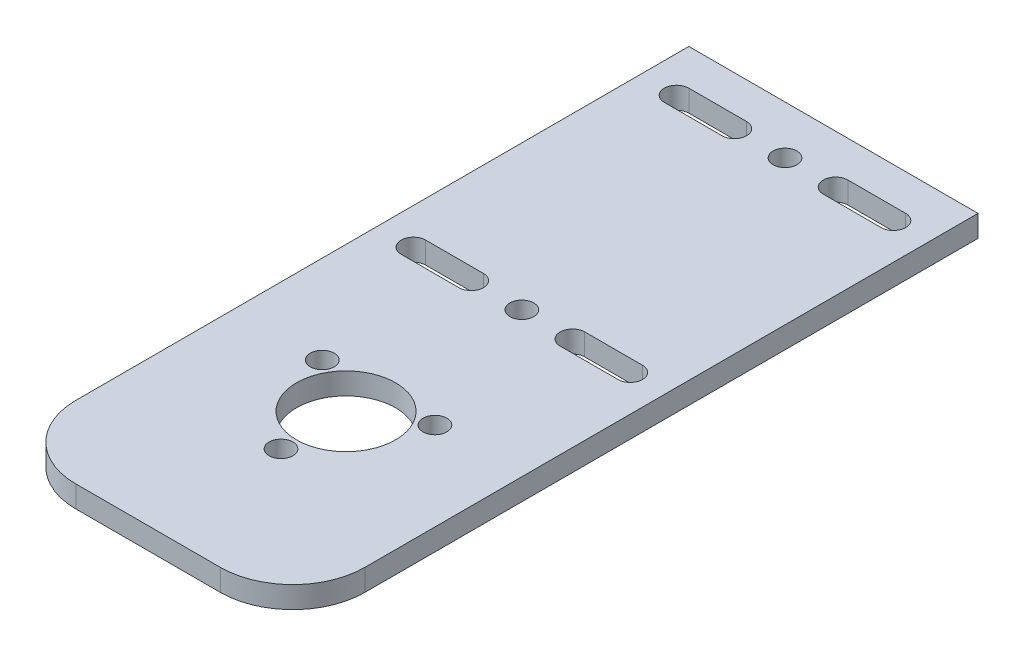
ISO-10303-21;
HEADER;
FILE_DESCRIPTION(('STEP AP214'),'2;1');
FILE_NAME('part.step','',(''),(''),'','','');
FILE_SCHEMA(('AUTOMOTIVE_DESIGN { 1 0 10303 214 1 1 1 1 }'));
ENDSEC;
DATA;
#1=APPLICATION_CONTEXT('core data for automotive mechanical design processes');
#2=APPLICATION_PROTOCOL_DEFINITION('international standard','automotive_design',2000,#1);
#3=PRODUCT_CONTEXT('',#1,'mechanical');
#4=PRODUCT('Part','Part','',(#3));
#5=PRODUCT_RELATED_PRODUCT_CATEGORY('part','',(#4));
#6=PRODUCT_DEFINITION_FORMATION('','',#4);
#7=PRODUCT_DEFINITION_CONTEXT('part definition',#1,'design');
#8=PRODUCT_DEFINITION('design','',#6,#7);
#9=PRODUCT_DEFINITION_SHAPE('','',#8);
#10=(LENGTH_UNIT() NAMED_UNIT(*) SI_UNIT(.MILLI.,.METRE.));
#11=(NAMED_UNIT(*) PLANE_ANGLE_UNIT() SI_UNIT($,.RADIAN.));
#12=(NAMED_UNIT(*) SI_UNIT($,.STERADIAN.) SOLID_ANGLE_UNIT());
#13=UNCERTAINTY_MEASURE_WITH_UNIT(LENGTH_MEASURE(1.E-05),#10,'distance_accuracy_value','');
#14=(GEOMETRIC_REPRESENTATION_CONTEXT(3) GLOBAL_UNCERTAINTY_ASSIGNED_CONTEXT((#13)) GLOBAL_UNIT_ASSIGNED_CONTEXT((#10,
#11,#12)) REPRESENTATION_CONTEXT('',''));
#15=CARTESIAN_POINT('',(0.,0.,0.));
#16=DIRECTION('',(0.,0.,1.));
#17=DIRECTION('',(1.,0.,0.));
#18=AXIS2_PLACEMENT_3D('',#15,#16,#17);
#19=CARTESIAN_POINT('',(0.,3.,36.4));
#20=DIRECTION('',(0.,0.,-1.));
#21=DIRECTION('',(-1.,0.,0.));
#22=AXIS2_PLACEMENT_3D('',#19,#20,#21);
#23=PLANE('',#22);
#24=DIRECTION('',(1.,0.,0.));
#25=VECTOR('',#24,1.);
#26=CARTESIAN_POINT('',(0.,0.,36.4));
#27=LINE('',#26,#25);
#28=CARTESIAN_POINT('',(5.,0.,36.4));
#29=VERTEX_POINT('',#28);
#30=CARTESIAN_POINT('',(13.,0.,36.4));
#31=VERTEX_POINT('',#30);
#32=EDGE_CURVE('E316',#29,#31,#27,.T.);
#33=ORIENTED_EDGE('',*,*,#32,.T.);
#34=DIRECTION('',(0.,-1.,0.));
#35=VECTOR('',#34,1.);
#36=CARTESIAN_POINT('',(13.,3.,36.4));
#37=LINE('',#36,#35);
#38=CARTESIAN_POINT('',(13.,3.,36.4));
#39=VERTEX_POINT('',#38);
#40=EDGE_CURVE('E342',#39,#31,#37,.T.);
#41=ORIENTED_EDGE('',*,*,#40,.F.);
#42=DIRECTION('',(1.,0.,0.));
#43=VECTOR('',#42,1.);
#44=CARTESIAN_POINT('',(0.,3.,36.4));
#45=LINE('',#44,#43);
#46=CARTESIAN_POINT('',(5.,3.,36.4));
#47=VERTEX_POINT('',#46);
#48=EDGE_CURVE('E246',#47,#39,#45,.T.);
#49=ORIENTED_EDGE('',*,*,#48,.F.);
#50=DIRECTION('',(0.,-1.,0.));
#51=VECTOR('',#50,1.);
#52=CARTESIAN_POINT('',(5.,3.,36.4));
#53=LINE('',#52,#51);
#54=EDGE_CURVE('E334',#47,#29,#53,.T.);
#55=ORIENTED_EDGE('',*,*,#54,.T.);
#56=EDGE_LOOP('',(#33,#41,#49,#55));
#57=FACE_BOUND('',#56,.T.);
#58=ADVANCED_FACE('F36',(#57),#23,.F.);
#59=CARTESIAN_POINT('',(13.,3.,38.1));
#60=DIRECTION('',(0.,-1.,0.));
#61=DIRECTION('',(0.,0.,-1.));
#62=AXIS2_PLACEMENT_3D('',#59,#60,#61);
#63=CYLINDRICAL_SURFACE('',#62,1.7);
#64=CARTESIAN_POINT('',(13.,0.,38.1));
#65=DIRECTION('',(0.,1.,0.));
#66=DIRECTION('',(0.,0.,1.));
#67=AXIS2_PLACEMENT_3D('',#64,#65,#66);
#68=CIRCLE('',#67,1.7);
#69=CARTESIAN_POINT('',(13.,0.,39.8));
#70=VERTEX_POINT('',#69);
#71=EDGE_CURVE('E319',#31,#70,#68,.F.);
#72=ORIENTED_EDGE('',*,*,#71,.T.);
#73=DIRECTION('',(0.,-1.,0.));
#74=VECTOR('',#73,1.);
#75=CARTESIAN_POINT('',(13.,3.,39.8));
#76=LINE('',#75,#74);
#77=CARTESIAN_POINT('',(13.,3.,39.8));
#78=VERTEX_POINT('',#77);
#79=EDGE_CURVE('E340',#78,#70,#76,.T.);
#80=ORIENTED_EDGE('',*,*,#79,.F.);
#81=CARTESIAN_POINT('',(13.,3.,38.1));
#82=DIRECTION('',(0.,1.,0.));
#83=DIRECTION('',(0.,0.,1.));
#84=AXIS2_PLACEMENT_3D('',#81,#82,#83);
#85=CIRCLE('',#84,1.7);
#86=EDGE_CURVE('E249',#39,#78,#85,.F.);
#87=ORIENTED_EDGE('',*,*,#86,.F.);
#88=ORIENTED_EDGE('',*,*,#40,.T.);
#89=EDGE_LOOP('',(#72,#80,#87,#88));
#90=FACE_BOUND('',#89,.T.);
#91=ADVANCED_FACE('F430',(#90),#63,.F.);
#92=CARTESIAN_POINT('',(1.38083988687754E-13,3.,39.8000000000001));
#93=DIRECTION('',(0.,0.,-1.));
#94=DIRECTION('',(-1.,0.,0.));
#95=AXIS2_PLACEMENT_3D('',#92,#93,#94);
#96=PLANE('',#95);
#97=DIRECTION('',(1.,0.,0.));
#98=VECTOR('',#97,1.);
#99=CARTESIAN_POINT('',(1.38083988687754E-13,0.,39.8000000000001));
#100=LINE('',#99,#98);
#101=CARTESIAN_POINT('',(5.,0.,39.8));
#102=VERTEX_POINT('',#101);
#103=EDGE_CURVE('E322',#102,#70,#100,.T.);
#104=ORIENTED_EDGE('',*,*,#103,.F.);
#105=DIRECTION('',(0.,-1.,0.));
#106=VECTOR('',#105,1.);
#107=CARTESIAN_POINT('',(5.,3.,39.8));
#108=LINE('',#107,#106);
#109=CARTESIAN_POINT('',(5.,3.,39.8));
#110=VERTEX_POINT('',#109);
#111=EDGE_CURVE('E337',#110,#102,#108,.T.);
#112=ORIENTED_EDGE('',*,*,#111,.F.);
#113=DIRECTION('',(1.,0.,0.));
#114=VECTOR('',#113,1.);
#115=CARTESIAN_POINT('',(1.38083988687754E-13,3.,39.8000000000001));
#116=LINE('',#115,#114);
#117=EDGE_CURVE('E251',#110,#78,#116,.T.);
#118=ORIENTED_EDGE('',*,*,#117,.T.);
#119=ORIENTED_EDGE('',*,*,#79,.T.);
#120=EDGE_LOOP('',(#104,#112,#118,#119));
#121=FACE_BOUND('',#120,.T.);
#122=ADVANCED_FACE('F436',(#121),#96,.T.);
#123=CARTESIAN_POINT('',(0.,3.,36.4));
#124=DIRECTION('',(0.,0.,-1.));
#125=DIRECTION('',(-1.,0.,0.));
#126=AXIS2_PLACEMENT_3D('',#123,#124,#125);
#127=PLANE('',#126);
#128=DIRECTION('',(1.,0.,0.));
#129=VECTOR('',#128,1.);
#130=CARTESIAN_POINT('',(0.,0.,36.4));
#131=LINE('',#130,#129);
#132=CARTESIAN_POINT('',(27.,0.,36.4));
#133=VERTEX_POINT('',#132);
#134=CARTESIAN_POINT('',(35.,0.,36.4));
#135=VERTEX_POINT('',#134);
#136=EDGE_CURVE('E305',#133,#135,#131,.T.);
#137=ORIENTED_EDGE('',*,*,#136,.T.);
#138=DIRECTION('',(0.,-1.,0.));
#139=VECTOR('',#138,1.);
#140=CARTESIAN_POINT('',(35.,3.,36.4));
#141=LINE('',#140,#139);
#142=CARTESIAN_POINT('',(35.,3.,36.4));
#143=VERTEX_POINT('',#142);
#144=EDGE_CURVE('E338',#143,#135,#141,.T.);
#145=ORIENTED_EDGE('',*,*,#144,.F.);
#146=DIRECTION('',(1.,0.,0.));
#147=VECTOR('',#146,1.);
#148=CARTESIAN_POINT('',(0.,3.,36.4));
#149=LINE('',#148,#147);
#150=CARTESIAN_POINT('',(27.,3.,36.4));
#151=VERTEX_POINT('',#150);
#152=EDGE_CURVE('E236',#151,#143,#149,.T.);
#153=ORIENTED_EDGE('',*,*,#152,.F.);
#154=DIRECTION('',(0.,-1.,0.));
#155=VECTOR('',#154,1.);
#156=CARTESIAN_POINT('',(27.,3.,36.4));
#157=LINE('',#156,#155);
#158=EDGE_CURVE('E346',#151,#133,#157,.T.);
#159=ORIENTED_EDGE('',*,*,#158,.T.);
#160=EDGE_LOOP('',(#137,#145,#153,#159));
#161=FACE_BOUND('',#160,.T.);
#162=ADVANCED_FACE('F455',(#161),#127,.F.);
#163=CARTESIAN_POINT('',(35.,3.,38.1));
#164=DIRECTION('',(0.,-1.,0.));
#165=DIRECTION('',(0.,0.,-1.));
#166=AXIS2_PLACEMENT_3D('',#163,#164,#165);
#167=CYLINDRICAL_SURFACE('',#166,1.70000000000001);
#168=CARTESIAN_POINT('',(35.,0.,38.1));
#169=DIRECTION('',(0.,1.,0.));
#170=DIRECTION('',(0.,0.,1.));
#171=AXIS2_PLACEMENT_3D('',#168,#169,#170);
#172=CIRCLE('',#171,1.70000000000001);
#173=CARTESIAN_POINT('',(35.,0.,39.8));
#174=VERTEX_POINT('',#173);
#175=EDGE_CURVE('E308',#135,#174,#172,.F.);
#176=ORIENTED_EDGE('',*,*,#175,.T.);
#177=DIRECTION('',(0.,-1.,0.));
#178=VECTOR('',#177,1.);
#179=CARTESIAN_POINT('',(35.,3.,39.8));
#180=LINE('',#179,#178);
#181=CARTESIAN_POINT('',(35.,3.,39.8));
#182=VERTEX_POINT('',#181);
#183=EDGE_CURVE('E352',#182,#174,#180,.T.);
#184=ORIENTED_EDGE('',*,*,#183,.F.);
#185=CARTESIAN_POINT('',(35.,3.,38.1));
#186=DIRECTION('',(0.,1.,0.));
#187=DIRECTION('',(0.,0.,1.));
#188=AXIS2_PLACEMENT_3D('',#185,#186,#187);
#189=CIRCLE('',#188,1.70000000000001);
#190=EDGE_CURVE('E239',#143,#182,#189,.F.);
#191=ORIENTED_EDGE('',*,*,#190,.F.);
#192=ORIENTED_EDGE('',*,*,#144,.T.);
#193=EDGE_LOOP('',(#176,#184,#191,#192));
#194=FACE_BOUND('',#193,.T.);
#195=ADVANCED_FACE('F451',(#194),#167,.F.);
#196=CARTESIAN_POINT('',(-1.38083988687754E-13,3.,39.7999999999999));
#197=DIRECTION('',(0.,0.,-1.));
#198=DIRECTION('',(-1.,0.,0.));
#199=AXIS2_PLACEMENT_3D('',#196,#197,#198);
#200=PLANE('',#199);
#201=DIRECTION('',(1.,0.,0.));
#202=VECTOR('',#201,1.);
#203=CARTESIAN_POINT('',(-1.38083988687754E-13,0.,39.7999999999999));
#204=LINE('',#203,#202);
#205=CARTESIAN_POINT('',(27.,0.,39.8));
#206=VERTEX_POINT('',#205);
#207=EDGE_CURVE('E311',#206,#174,#204,.T.);
#208=ORIENTED_EDGE('',*,*,#207,.F.);
#209=DIRECTION('',(0.,-1.,0.));
#210=VECTOR('',#209,1.);
#211=CARTESIAN_POINT('',(27.,3.,39.8));
#212=LINE('',#211,#210);
#213=CARTESIAN_POINT('',(27.,3.,39.8));
#214=VERTEX_POINT('',#213);
#215=EDGE_CURVE('E349',#214,#206,#212,.T.);
#216=ORIENTED_EDGE('',*,*,#215,.F.);
#217=DIRECTION('',(1.,0.,0.));
#218=VECTOR('',#217,1.);
#219=CARTESIAN_POINT('',(-1.38083988687754E-13,3.,39.7999999999999));
#220=LINE('',#219,#218);
#221=EDGE_CURVE('E241',#214,#182,#220,.T.);
#222=ORIENTED_EDGE('',*,*,#221,.T.);
#223=ORIENTED_EDGE('',*,*,#183,.T.);
#224=EDGE_LOOP('',(#208,#216,#222,#223));
#225=FACE_BOUND('',#224,.T.);
#226=ADVANCED_FACE('F447',(#225),#200,.T.);
#227=CARTESIAN_POINT('',(35.,3.,1.69999999999999));
#228=DIRECTION('',(0.,-1.,0.));
#229=DIRECTION('',(0.,0.,-1.));
#230=AXIS2_PLACEMENT_3D('',#227,#228,#229);
#231=CYLINDRICAL_SURFACE('',#230,1.70000000000001);
#232=CARTESIAN_POINT('',(35.,0.,1.69999999999999));
#233=DIRECTION('',(0.,1.,0.));
#234=DIRECTION('',(0.,0.,1.));
#235=AXIS2_PLACEMENT_3D('',#232,#233,#234);
#236=CIRCLE('',#235,1.70000000000001);
#237=CARTESIAN_POINT('',(35.,0.,3.4));
#238=VERTEX_POINT('',#237);
#239=CARTESIAN_POINT('',(35.,0.,0.));
#240=VERTEX_POINT('',#239);
#241=EDGE_CURVE('E287',#238,#240,#236,.T.);
#242=ORIENTED_EDGE('',*,*,#241,.F.);
#243=DIRECTION('',(0.,-1.,0.));
#244=VECTOR('',#243,1.);
#245=CARTESIAN_POINT('',(35.,3.,3.4));
#246=LINE('',#245,#244);
#247=CARTESIAN_POINT('',(35.,3.,3.4));
#248=VERTEX_POINT('',#247);
#249=EDGE_CURVE('E350',#248,#238,#246,.T.);
#250=ORIENTED_EDGE('',*,*,#249,.F.);
#251=CARTESIAN_POINT('',(35.,3.,1.69999999999999));
#252=DIRECTION('',(0.,1.,0.));
#253=DIRECTION('',(0.,0.,1.));
#254=AXIS2_PLACEMENT_3D('',#251,#252,#253);
#255=CIRCLE('',#254,1.70000000000001);
#256=CARTESIAN_POINT('',(35.,3.,0.));
#257=VERTEX_POINT('',#256);
#258=EDGE_CURVE('E219',#248,#257,#255,.T.);
#259=ORIENTED_EDGE('',*,*,#258,.T.);
#260=DIRECTION('',(0.,-1.,0.));
#261=VECTOR('',#260,1.);
#262=CARTESIAN_POINT('',(35.,3.,0.));
#263=LINE('',#262,#261);
#264=EDGE_CURVE('E356',#257,#240,#263,.T.);
#265=ORIENTED_EDGE('',*,*,#264,.T.);
#266=EDGE_LOOP('',(#242,#250,#259,#265));
#267=FACE_BOUND('',#266,.T.);
#268=ADVANCED_FACE('F450',(#267),#231,.F.);
#269=CARTESIAN_POINT('',(0.,3.,3.4));
#270=DIRECTION('',(0.,0.,-1.));
#271=DIRECTION('',(-1.,0.,0.));
#272=AXIS2_PLACEMENT_3D('',#269,#270,#271);
#273=PLANE('',#272);
#274=DIRECTION('',(1.,0.,0.));
#275=VECTOR('',#274,1.);
#276=CARTESIAN_POINT('',(0.,0.,3.4));
#277=LINE('',#276,#275);
#278=CARTESIAN_POINT('',(27.,0.,3.4));
#279=VERTEX_POINT('',#278);
#280=EDGE_CURVE('E290',#279,#238,#277,.T.);
#281=ORIENTED_EDGE('',*,*,#280,.F.);
#282=DIRECTION('',(0.,-1.,0.));
#283=VECTOR('',#282,1.);
#284=CARTESIAN_POINT('',(27.,3.,3.4));
#285=LINE('',#284,#283);
#286=CARTESIAN_POINT('',(27.,3.,3.4));
#287=VERTEX_POINT('',#286);
#288=EDGE_CURVE('E361',#287,#279,#285,.T.);
#289=ORIENTED_EDGE('',*,*,#288,.F.);
#290=DIRECTION('',(1.,0.,0.));
#291=VECTOR('',#290,1.);
#292=CARTESIAN_POINT('',(0.,3.,3.4));
#293=LINE('',#292,#291);
#294=EDGE_CURVE('E222',#287,#248,#293,.T.);
#295=ORIENTED_EDGE('',*,*,#294,.T.);
#296=ORIENTED_EDGE('',*,*,#249,.T.);
#297=EDGE_LOOP('',(#281,#289,#295,#296));
#298=FACE_BOUND('',#297,.T.);
#299=ADVANCED_FACE('F475',(#298),#273,.T.);
#300=CARTESIAN_POINT('',(27.,3.,1.69999999999999));
#301=DIRECTION('',(0.,-1.,0.));
#302=DIRECTION('',(0.,0.,-1.));
#303=AXIS2_PLACEMENT_3D('',#300,#301,#302);
#304=CYLINDRICAL_SURFACE('',#303,1.70000000000001);
#305=CARTESIAN_POINT('',(27.,0.,1.69999999999999));
#306=DIRECTION('',(0.,1.,0.));
#307=DIRECTION('',(0.,0.,1.));
#308=AXIS2_PLACEMENT_3D('',#305,#306,#307);
#309=CIRCLE('',#308,1.70000000000001);
#310=CARTESIAN_POINT('',(27.,0.,0.));
#311=VERTEX_POINT('',#310);
#312=EDGE_CURVE('E293',#311,#279,#309,.T.);
#313=ORIENTED_EDGE('',*,*,#312,.F.);
#314=DIRECTION('',(0.,-1.,0.));
#315=VECTOR('',#314,1.);
#316=CARTESIAN_POINT('',(27.,3.,0.));
#317=LINE('',#316,#315);
#318=CARTESIAN_POINT('',(27.,3.,0.));
#319=VERTEX_POINT('',#318);
#320=EDGE_CURVE('E358',#319,#311,#317,.T.);
#321=ORIENTED_EDGE('',*,*,#320,.F.);
#322=CARTESIAN_POINT('',(27.,3.,1.69999999999999));
#323=DIRECTION('',(0.,1.,0.));
#324=DIRECTION('',(0.,0.,1.));
#325=AXIS2_PLACEMENT_3D('',#322,#323,#324);
#326=CIRCLE('',#325,1.70000000000001);
#327=EDGE_CURVE('E225',#319,#287,#326,.T.);
#328=ORIENTED_EDGE('',*,*,#327,.T.);
#329=ORIENTED_EDGE('',*,*,#288,.T.);
#330=EDGE_LOOP('',(#313,#321,#328,#329));
#331=FACE_BOUND('',#330,.T.);
#332=ADVANCED_FACE('F471',(#331),#304,.F.);
#333=CARTESIAN_POINT('',(13.,3.,1.69999999999999));
#334=DIRECTION('',(0.,-1.,0.));
#335=DIRECTION('',(0.,0.,-1.));
#336=AXIS2_PLACEMENT_3D('',#333,#334,#335);
#337=CYLINDRICAL_SURFACE('',#336,1.70000000000001);
#338=CARTESIAN_POINT('',(13.,0.,1.69999999999999));
#339=DIRECTION('',(0.,1.,0.));
#340=DIRECTION('',(0.,0.,1.));
#341=AXIS2_PLACEMENT_3D('',#338,#339,#340);
#342=CIRCLE('',#341,1.70000000000001);
#343=CARTESIAN_POINT('',(13.,0.,3.4));
#344=VERTEX_POINT('',#343);
#345=CARTESIAN_POINT('',(13.,0.,0.));
#346=VERTEX_POINT('',#345);
#347=EDGE_CURVE('E275',#344,#346,#342,.T.);
#348=ORIENTED_EDGE('',*,*,#347,.F.);
#349=DIRECTION('',(0.,-1.,0.));
#350=VECTOR('',#349,1.);
#351=CARTESIAN_POINT('',(13.,3.,3.4));
#352=LINE('',#351,#350);
#353=CARTESIAN_POINT('',(13.,3.,3.4));
#354=VERTEX_POINT('',#353);
#355=EDGE_CURVE('E359',#354,#344,#352,.T.);
#356=ORIENTED_EDGE('',*,*,#355,.F.);
#357=CARTESIAN_POINT('',(13.,3.,1.69999999999999));
#358=DIRECTION('',(0.,1.,0.));
#359=DIRECTION('',(0.,0.,1.));
#360=AXIS2_PLACEMENT_3D('',#357,#358,#359);
#361=CIRCLE('',#360,1.70000000000001);
#362=CARTESIAN_POINT('',(13.,3.,0.));
#363=VERTEX_POINT('',#362);
#364=EDGE_CURVE('E203',#354,#363,#361,.T.);
#365=ORIENTED_EDGE('',*,*,#364,.T.);
#366=DIRECTION('',(0.,-1.,0.));
#367=VECTOR('',#366,1.);
#368=CARTESIAN_POINT('',(13.,3.,0.));
#369=LINE('',#368,#367);
#370=EDGE_CURVE('E262',#363,#346,#369,.T.);
#371=ORIENTED_EDGE('',*,*,#370,.T.);
#372=EDGE_LOOP('',(#348,#356,#365,#371));
#373=FACE_BOUND('',#372,.T.);
#374=ADVANCED_FACE('F474',(#373),#337,.F.);
#375=CARTESIAN_POINT('',(0.,3.,3.4));
#376=DIRECTION('',(0.,0.,-1.));
#377=DIRECTION('',(-1.,0.,0.));
#378=AXIS2_PLACEMENT_3D('',#375,#376,#377);
#379=PLANE('',#378);
#380=DIRECTION('',(1.,0.,0.));
#381=VECTOR('',#380,1.);
#382=CARTESIAN_POINT('',(0.,0.,3.4));
#383=LINE('',#382,#381);
#384=CARTESIAN_POINT('',(5.,0.,3.4));
#385=VERTEX_POINT('',#384);
#386=EDGE_CURVE('E278',#385,#344,#383,.T.);
#387=ORIENTED_EDGE('',*,*,#386,.F.);
#388=DIRECTION('',(0.,-1.,0.));
#389=VECTOR('',#388,1.);
#390=CARTESIAN_POINT('',(5.,3.,3.4));
#391=LINE('',#390,#389);
#392=CARTESIAN_POINT('',(5.,3.,3.4));
#393=VERTEX_POINT('',#392);
#394=EDGE_CURVE('E367',#393,#385,#391,.T.);
#395=ORIENTED_EDGE('',*,*,#394,.F.);
#396=DIRECTION('',(1.,0.,0.));
#397=VECTOR('',#396,1.);
#398=CARTESIAN_POINT('',(0.,3.,3.4));
#399=LINE('',#398,#397);
#400=EDGE_CURVE('E207',#393,#354,#399,.T.);
#401=ORIENTED_EDGE('',*,*,#400,.T.);
#402=ORIENTED_EDGE('',*,*,#355,.T.);
#403=EDGE_LOOP('',(#387,#395,#401,#402));
#404=FACE_BOUND('',#403,.T.);
#405=ADVANCED_FACE('F489',(#404),#379,.T.);
#406=CARTESIAN_POINT('',(5.,3.,1.69999999999999));
#407=DIRECTION('',(0.,-1.,0.));
#408=DIRECTION('',(0.,0.,-1.));
#409=AXIS2_PLACEMENT_3D('',#406,#407,#408);
#410=CYLINDRICAL_SURFACE('',#409,1.70000000000001);
#411=CARTESIAN_POINT('',(5.,0.,1.69999999999999));
#412=DIRECTION('',(0.,1.,0.));
#413=DIRECTION('',(0.,0.,1.));
#414=AXIS2_PLACEMENT_3D('',#411,#412,#413);
#415=CIRCLE('',#414,1.70000000000001);
#416=CARTESIAN_POINT('',(5.,0.,0.));
#417=VERTEX_POINT('',#416);
#418=EDGE_CURVE('E281',#417,#385,#415,.T.);
#419=ORIENTED_EDGE('',*,*,#418,.F.);
#420=DIRECTION('',(0.,-1.,0.));
#421=VECTOR('',#420,1.);
#422=CARTESIAN_POINT('',(5.,3.,0.));
#423=LINE('',#422,#421);
#424=CARTESIAN_POINT('',(5.,3.,0.));
#425=VERTEX_POINT('',#424);
#426=EDGE_CURVE('E365',#425,#417,#423,.T.);
#427=ORIENTED_EDGE('',*,*,#426,.F.);
#428=CARTESIAN_POINT('',(5.,3.,1.69999999999999));
#429=DIRECTION('',(0.,1.,0.));
#430=DIRECTION('',(0.,0.,1.));
#431=AXIS2_PLACEMENT_3D('',#428,#429,#430);
#432=CIRCLE('',#431,1.70000000000001);
#433=EDGE_CURVE('E214',#425,#393,#432,.T.);
#434=ORIENTED_EDGE('',*,*,#433,.T.);
#435=ORIENTED_EDGE('',*,*,#394,.T.);
#436=EDGE_LOOP('',(#419,#427,#434,#435));
#437=FACE_BOUND('',#436,.T.);
#438=ADVANCED_FACE('F486',(#437),#410,.F.);
#439=CARTESIAN_POINT('',(0.,3.,0.));
#440=DIRECTION('',(1.,0.,0.));
#441=DIRECTION('',(0.,0.,-1.));
#442=AXIS2_PLACEMENT_3D('',#439,#440,#441);
#443=PLANE('',#442);
#444=DIRECTION('',(0.,0.,1.));
#445=VECTOR('',#444,1.);
#446=CARTESIAN_POINT('',(0.,3.,0.));
#447=LINE('',#446,#445);
#448=CARTESIAN_POINT('',(0.,3.,-5.));
#449=VERTEX_POINT('',#448);
#450=CARTESIAN_POINT('',(0.,3.,79.81));
#451=VERTEX_POINT('',#450);
#452=EDGE_CURVE('E58',#449,#451,#447,.T.);
#453=ORIENTED_EDGE('',*,*,#452,.F.);
#454=DIRECTION('',(0.,1.,0.));
#455=VECTOR('',#454,1.);
#456=CARTESIAN_POINT('',(0.,-7.,-5.));
#457=LINE('',#456,#455);
#458=CARTESIAN_POINT('',(0.,0.,-5.));
#459=VERTEX_POINT('',#458);
#460=EDGE_CURVE('E185',#459,#449,#457,.T.);
#461=ORIENTED_EDGE('',*,*,#460,.F.);
#462=DIRECTION('',(0.,0.,1.));
#463=VECTOR('',#462,1.);
#464=CARTESIAN_POINT('',(0.,0.,0.));
#465=LINE('',#464,#463);
#466=CARTESIAN_POINT('',(0.,0.,79.81));
#467=VERTEX_POINT('',#466);
#468=EDGE_CURVE('E269',#459,#467,#465,.T.);
#469=ORIENTED_EDGE('',*,*,#468,.T.);
#470=DIRECTION('',(0.,-1.,0.));
#471=VECTOR('',#470,1.);
#472=CARTESIAN_POINT('',(0.,3.,79.81));
#473=LINE('',#472,#471);
#474=EDGE_CURVE('E44',#467,#451,#473,.F.);
#475=ORIENTED_EDGE('',*,*,#474,.T.);
#476=EDGE_LOOP('',(#453,#461,#469,#475));
#477=FACE_BOUND('',#476,.T.);
#478=ADVANCED_FACE('F386',(#477),#443,.F.);
#479=CARTESIAN_POINT('',(0.,3.,89.81));
#480=DIRECTION('',(0.,0.,-1.));
#481=DIRECTION('',(-1.,0.,0.));
#482=AXIS2_PLACEMENT_3D('',#479,#480,#481);
#483=PLANE('',#482);
#484=DIRECTION('',(1.,0.,0.));
#485=VECTOR('',#484,1.);
#486=CARTESIAN_POINT('',(0.,0.,89.81));
#487=LINE('',#486,#485);
#488=CARTESIAN_POINT('',(10.,0.,89.81));
#489=VERTEX_POINT('',#488);
#490=CARTESIAN_POINT('',(30.,0.,89.81));
#491=VERTEX_POINT('',#490);
#492=EDGE_CURVE('E271',#489,#491,#487,.T.);
#493=ORIENTED_EDGE('',*,*,#492,.T.);
#494=DIRECTION('',(0.,-1.,0.));
#495=VECTOR('',#494,1.);
#496=CARTESIAN_POINT('',(30.,3.,89.81));
#497=LINE('',#496,#495);
#498=CARTESIAN_POINT('',(30.,3.,89.81));
#499=VERTEX_POINT('',#498);
#500=EDGE_CURVE('E379',#491,#499,#497,.F.);
#501=ORIENTED_EDGE('',*,*,#500,.T.);
#502=DIRECTION('',(1.,0.,0.));
#503=VECTOR('',#502,1.);
#504=CARTESIAN_POINT('',(0.,3.,89.81));
#505=LINE('',#504,#503);
#506=CARTESIAN_POINT('',(10.,3.,89.81));
#507=VERTEX_POINT('',#506);
#508=EDGE_CURVE('E204',#507,#499,#505,.T.);
#509=ORIENTED_EDGE('',*,*,#508,.F.);
#510=DIRECTION('',(0.,-1.,0.));
#511=VECTOR('',#510,1.);
#512=CARTESIAN_POINT('',(10.,3.,89.81));
#513=LINE('',#512,#511);
#514=EDGE_CURVE('E376',#507,#489,#513,.T.);
#515=ORIENTED_EDGE('',*,*,#514,.T.);
#516=EDGE_LOOP('',(#493,#501,#509,#515));
#517=FACE_BOUND('',#516,.T.);
#518=ADVANCED_FACE('F392',(#517),#483,.F.);
#519=CARTESIAN_POINT('',(40.,3.,0.));
#520=DIRECTION('',(-1.,0.,0.));
#521=DIRECTION('',(0.,0.,1.));
#522=AXIS2_PLACEMENT_3D('',#519,#520,#521);
#523=PLANE('',#522);
#524=DIRECTION('',(0.,0.,-1.));
#525=VECTOR('',#524,1.);
#526=CARTESIAN_POINT('',(40.,0.,0.));
#527=LINE('',#526,#525);
#528=CARTESIAN_POINT('',(40.,0.,79.81));
#529=VERTEX_POINT('',#528);
#530=CARTESIAN_POINT('',(40.,0.,-5.00000000000002));
#531=VERTEX_POINT('',#530);
#532=EDGE_CURVE('E196',#529,#531,#527,.T.);
#533=ORIENTED_EDGE('',*,*,#532,.T.);
#534=DIRECTION('',(0.,1.,0.));
#535=VECTOR('',#534,1.);
#536=CARTESIAN_POINT('',(40.,-7.,-5.00000000000002));
#537=LINE('',#536,#535);
#538=CARTESIAN_POINT('',(40.,3.,-5.00000000000002));
#539=VERTEX_POINT('',#538);
#540=EDGE_CURVE('E51',#531,#539,#537,.T.);
#541=ORIENTED_EDGE('',*,*,#540,.T.);
#542=DIRECTION('',(0.,0.,-1.));
#543=VECTOR('',#542,1.);
#544=CARTESIAN_POINT('',(40.,3.,0.));
#545=LINE('',#544,#543);
#546=CARTESIAN_POINT('',(40.,3.,79.81));
#547=VERTEX_POINT('',#546);
#548=EDGE_CURVE('E193',#547,#539,#545,.T.);
#549=ORIENTED_EDGE('',*,*,#548,.F.);
#550=DIRECTION('',(0.,-1.,0.));
#551=VECTOR('',#550,1.);
#552=CARTESIAN_POINT('',(40.,3.,79.81));
#553=LINE('',#552,#551);
#554=EDGE_CURVE('E345',#547,#529,#553,.T.);
#555=ORIENTED_EDGE('',*,*,#554,.T.);
#556=EDGE_LOOP('',(#533,#541,#549,#555));
#557=FACE_BOUND('',#556,.T.);
#558=ADVANCED_FACE('F191',(#557),#523,.F.);
#559=CARTESIAN_POINT('',(12.20577136594,3.,57.92));
#560=DIRECTION('',(0.,-1.,0.));
#561=DIRECTION('',(0.,0.,-1.));
#562=AXIS2_PLACEMENT_3D('',#559,#560,#561);
#563=CYLINDRICAL_SURFACE('',#562,1.65);
#564=CARTESIAN_POINT('',(12.20577136594,3.,57.92));
#565=DIRECTION('',(0.,1.,0.));
#566=DIRECTION('',(0.,0.,1.));
#567=AXIS2_PLACEMENT_3D('',#564,#565,#566);
#568=CIRCLE('',#567,1.65);
#569=CARTESIAN_POINT('',(12.20577136594,3.,59.57));
#570=VERTEX_POINT('',#569);
#571=EDGE_CURVE('E256',#570,#570,#568,.F.);
#572=ORIENTED_EDGE('',*,*,#571,.F.);
#573=EDGE_LOOP('',(#572));
#574=FACE_BOUND('',#573,.T.);
#575=CARTESIAN_POINT('',(12.20577136594,0.,57.92));
#576=DIRECTION('',(0.,1.,0.));
#577=DIRECTION('',(0.,0.,1.));
#578=AXIS2_PLACEMENT_3D('',#575,#576,#577);
#579=CIRCLE('',#578,1.65);
#580=CARTESIAN_POINT('',(12.20577136594,0.,59.57));
#581=VERTEX_POINT('',#580);
#582=EDGE_CURVE('E327',#581,#581,#579,.F.);
#583=ORIENTED_EDGE('',*,*,#582,.T.);
#584=EDGE_LOOP('',(#583));
#585=FACE_BOUND('',#584,.T.);
#586=ADVANCED_FACE('F499',(#574,#585),#563,.F.);
#587=CARTESIAN_POINT('',(5.,3.,38.1));
#588=DIRECTION('',(0.,-1.,0.));
#589=DIRECTION('',(0.,0.,-1.));
#590=AXIS2_PLACEMENT_3D('',#587,#588,#589);
#591=CYLINDRICAL_SURFACE('',#590,1.70000000000001);
#592=CARTESIAN_POINT('',(5.,0.,38.1));
#593=DIRECTION('',(0.,1.,0.));
#594=DIRECTION('',(0.,0.,1.));
#595=AXIS2_PLACEMENT_3D('',#592,#593,#594);
#596=CIRCLE('',#595,1.70000000000001);
#597=EDGE_CURVE('E325',#102,#29,#596,.F.);
#598=ORIENTED_EDGE('',*,*,#597,.T.);
#599=ORIENTED_EDGE('',*,*,#54,.F.);
#600=CARTESIAN_POINT('',(5.,3.,38.1));
#601=DIRECTION('',(0.,1.,0.));
#602=DIRECTION('',(0.,0.,1.));
#603=AXIS2_PLACEMENT_3D('',#600,#601,#602);
#604=CIRCLE('',#603,1.70000000000001);
#605=EDGE_CURVE('E254',#110,#47,#604,.F.);
#606=ORIENTED_EDGE('',*,*,#605,.F.);
#607=ORIENTED_EDGE('',*,*,#111,.T.);
#608=EDGE_LOOP('',(#598,#599,#606,#607));
#609=FACE_BOUND('',#608,.T.);
#610=ADVANCED_FACE('F445',(#609),#591,.F.);
#611=CARTESIAN_POINT('',(27.,3.,38.1));
#612=DIRECTION('',(0.,-1.,0.));
#613=DIRECTION('',(0.,0.,-1.));
#614=AXIS2_PLACEMENT_3D('',#611,#612,#613);
#615=CYLINDRICAL_SURFACE('',#614,1.7);
#616=CARTESIAN_POINT('',(27.,0.,38.1));
#617=DIRECTION('',(0.,1.,0.));
#618=DIRECTION('',(0.,0.,1.));
#619=AXIS2_PLACEMENT_3D('',#616,#617,#618);
#620=CIRCLE('',#619,1.7);
#621=EDGE_CURVE('E314',#206,#133,#620,.F.);
#622=ORIENTED_EDGE('',*,*,#621,.T.);
#623=ORIENTED_EDGE('',*,*,#158,.F.);
#624=CARTESIAN_POINT('',(27.,3.,38.1));
#625=DIRECTION('',(0.,1.,0.));
#626=DIRECTION('',(0.,0.,1.));
#627=AXIS2_PLACEMENT_3D('',#624,#625,#626);
#628=CIRCLE('',#627,1.7);
#629=EDGE_CURVE('E244',#214,#151,#628,.F.);
#630=ORIENTED_EDGE('',*,*,#629,.F.);
#631=ORIENTED_EDGE('',*,*,#215,.T.);
#632=EDGE_LOOP('',(#622,#623,#630,#631));
#633=FACE_BOUND('',#632,.T.);
#634=ADVANCED_FACE('F441',(#633),#615,.F.);
#635=CARTESIAN_POINT('',(20.,3.,38.1));
#636=DIRECTION('',(0.,-1.,0.));
#637=DIRECTION('',(0.,0.,-1.));
#638=AXIS2_PLACEMENT_3D('',#635,#636,#637);
#639=CYLINDRICAL_SURFACE('',#638,1.65);
#640=CARTESIAN_POINT('',(20.,3.,38.1));
#641=DIRECTION('',(0.,1.,0.));
#642=DIRECTION('',(0.,0.,1.));
#643=AXIS2_PLACEMENT_3D('',#640,#641,#642);
#644=CIRCLE('',#643,1.65);
#645=CARTESIAN_POINT('',(20.,3.,39.75));
#646=VERTEX_POINT('',#645);
#647=EDGE_CURVE('E233',#646,#646,#644,.F.);
#648=ORIENTED_EDGE('',*,*,#647,.F.);
#649=EDGE_LOOP('',(#648));
#650=FACE_BOUND('',#649,.T.);
#651=CARTESIAN_POINT('',(20.,0.,38.1));
#652=DIRECTION('',(0.,1.,0.));
#653=DIRECTION('',(0.,0.,1.));
#654=AXIS2_PLACEMENT_3D('',#651,#652,#653);
#655=CIRCLE('',#654,1.65);
#656=CARTESIAN_POINT('',(20.,0.,39.75));
#657=VERTEX_POINT('',#656);
#658=EDGE_CURVE('E302',#657,#657,#655,.F.);
#659=ORIENTED_EDGE('',*,*,#658,.T.);
#660=EDGE_LOOP('',(#659));
#661=FACE_BOUND('',#660,.T.);
#662=ADVANCED_FACE('F444',(#650,#661),#639,.F.);
#663=CARTESIAN_POINT('',(20.,3.,1.7));
#664=DIRECTION('',(0.,-1.,0.));
#665=DIRECTION('',(0.,0.,-1.));
#666=AXIS2_PLACEMENT_3D('',#663,#664,#665);
#667=CYLINDRICAL_SURFACE('',#666,1.65);
#668=CARTESIAN_POINT('',(20.,3.,1.7));
#669=DIRECTION('',(0.,1.,0.));
#670=DIRECTION('',(0.,0.,1.));
#671=AXIS2_PLACEMENT_3D('',#668,#669,#670);
#672=CIRCLE('',#671,1.65);
#673=CARTESIAN_POINT('',(20.,3.,3.35));
#674=VERTEX_POINT('',#673);
#675=EDGE_CURVE('E230',#674,#674,#672,.T.);
#676=ORIENTED_EDGE('',*,*,#675,.T.);
#677=EDGE_LOOP('',(#676));
#678=FACE_BOUND('',#677,.T.);
#679=CARTESIAN_POINT('',(20.,0.,1.7));
#680=DIRECTION('',(0.,1.,0.));
#681=DIRECTION('',(0.,0.,1.));
#682=AXIS2_PLACEMENT_3D('',#679,#680,#681);
#683=CIRCLE('',#682,1.65);
#684=CARTESIAN_POINT('',(20.,0.,3.35));
#685=VERTEX_POINT('',#684);
#686=EDGE_CURVE('E299',#685,#685,#683,.T.);
#687=ORIENTED_EDGE('',*,*,#686,.F.);
#688=EDGE_LOOP('',(#687));
#689=FACE_BOUND('',#688,.T.);
#690=ADVANCED_FACE('F462',(#678,#689),#667,.F.);
#691=CARTESIAN_POINT('',(0.,3.,0.));
#692=DIRECTION('',(0.,0.,-1.));
#693=DIRECTION('',(-1.,0.,0.));
#694=AXIS2_PLACEMENT_3D('',#691,#692,#693);
#695=PLANE('',#694);
#696=DIRECTION('',(1.,0.,0.));
#697=VECTOR('',#696,1.);
#698=CARTESIAN_POINT('',(0.,0.,0.));
#699=LINE('',#698,#697);
#700=EDGE_CURVE('E296',#311,#240,#699,.T.);
#701=ORIENTED_EDGE('',*,*,#700,.T.);
#702=ORIENTED_EDGE('',*,*,#264,.F.);
#703=DIRECTION('',(1.,0.,0.));
#704=VECTOR('',#703,1.);
#705=CARTESIAN_POINT('',(0.,3.,0.));
#706=LINE('',#705,#704);
#707=EDGE_CURVE('E228',#319,#257,#706,.T.);
#708=ORIENTED_EDGE('',*,*,#707,.F.);
#709=ORIENTED_EDGE('',*,*,#320,.T.);
#710=EDGE_LOOP('',(#701,#702,#708,#709));
#711=FACE_BOUND('',#710,.T.);
#712=ADVANCED_FACE('F466',(#711),#695,.F.);
#713=CARTESIAN_POINT('',(0.,3.,0.));
#714=DIRECTION('',(0.,0.,-1.));
#715=DIRECTION('',(-1.,0.,0.));
#716=AXIS2_PLACEMENT_3D('',#713,#714,#715);
#717=PLANE('',#716);
#718=DIRECTION('',(1.,0.,0.));
#719=VECTOR('',#718,1.);
#720=CARTESIAN_POINT('',(0.,0.,0.));
#721=LINE('',#720,#719);
#722=EDGE_CURVE('E284',#417,#346,#721,.T.);
#723=ORIENTED_EDGE('',*,*,#722,.T.);
#724=ORIENTED_EDGE('',*,*,#370,.F.);
#725=DIRECTION('',(1.,0.,0.));
#726=VECTOR('',#725,1.);
#727=CARTESIAN_POINT('',(0.,3.,0.));
#728=LINE('',#727,#726);
#729=EDGE_CURVE('E217',#425,#363,#728,.T.);
#730=ORIENTED_EDGE('',*,*,#729,.F.);
#731=ORIENTED_EDGE('',*,*,#426,.T.);
#732=EDGE_LOOP('',(#723,#724,#730,#731));
#733=FACE_BOUND('',#732,.T.);
#734=ADVANCED_FACE('F414',(#733),#717,.F.);
#735=CARTESIAN_POINT('',(27.79422863406,3.,57.92));
#736=DIRECTION('',(0.,-1.,0.));
#737=DIRECTION('',(0.,0.,-1.));
#738=AXIS2_PLACEMENT_3D('',#735,#736,#737);
#739=CYLINDRICAL_SURFACE('',#738,1.65);
#740=CARTESIAN_POINT('',(27.79422863406,3.,57.92));
#741=DIRECTION('',(0.,1.,0.));
#742=DIRECTION('',(0.,0.,1.));
#743=AXIS2_PLACEMENT_3D('',#740,#741,#742);
#744=CIRCLE('',#743,1.65);
#745=CARTESIAN_POINT('',(27.79422863406,3.,59.57));
#746=VERTEX_POINT('',#745);
#747=EDGE_CURVE('E404',#746,#746,#744,.F.);
#748=ORIENTED_EDGE('',*,*,#747,.F.);
#749=EDGE_LOOP('',(#748));
#750=FACE_BOUND('',#749,.T.);
#751=CARTESIAN_POINT('',(27.79422863406,0.,57.92));
#752=DIRECTION('',(0.,1.,0.));
#753=DIRECTION('',(0.,0.,1.));
#754=AXIS2_PLACEMENT_3D('',#751,#752,#753);
#755=CIRCLE('',#754,1.65);
#756=CARTESIAN_POINT('',(27.79422863406,0.,59.57));
#757=VERTEX_POINT('',#756);
#758=EDGE_CURVE('E266',#757,#757,#755,.F.);
#759=ORIENTED_EDGE('',*,*,#758,.T.);
#760=EDGE_LOOP('',(#759));
#761=FACE_BOUND('',#760,.T.);
#762=ADVANCED_FACE('F410',(#750,#761),#739,.F.);
#763=CARTESIAN_POINT('',(20.,3.,71.42));
#764=DIRECTION('',(0.,-1.,0.));
#765=DIRECTION('',(0.,0.,-1.));
#766=AXIS2_PLACEMENT_3D('',#763,#764,#765);
#767=CYLINDRICAL_SURFACE('',#766,1.65);
#768=CARTESIAN_POINT('',(20.,3.,71.42));
#769=DIRECTION('',(0.,1.,0.));
#770=DIRECTION('',(0.,0.,1.));
#771=AXIS2_PLACEMENT_3D('',#768,#769,#770);
#772=CIRCLE('',#771,1.65);
#773=CARTESIAN_POINT('',(20.,3.,73.07));
#774=VERTEX_POINT('',#773);
#775=EDGE_CURVE('E333',#774,#774,#772,.F.);
#776=ORIENTED_EDGE('',*,*,#775,.F.);
#777=EDGE_LOOP('',(#776));
#778=FACE_BOUND('',#777,.T.);
#779=CARTESIAN_POINT('',(20.,0.,71.42));
#780=DIRECTION('',(0.,1.,0.));
#781=DIRECTION('',(0.,0.,1.));
#782=AXIS2_PLACEMENT_3D('',#779,#780,#781);
#783=CIRCLE('',#782,1.65);
#784=CARTESIAN_POINT('',(20.,0.,73.07));
#785=VERTEX_POINT('',#784);
#786=EDGE_CURVE('E263',#785,#785,#783,.F.);
#787=ORIENTED_EDGE('',*,*,#786,.T.);
#788=EDGE_LOOP('',(#787));
#789=FACE_BOUND('',#788,.T.);
#790=ADVANCED_FACE('F413',(#778,#789),#767,.F.);
#791=CARTESIAN_POINT('',(20.,3.,62.42));
#792=DIRECTION('',(0.,-1.,0.));
#793=DIRECTION('',(0.,0.,-1.));
#794=AXIS2_PLACEMENT_3D('',#791,#792,#793);
#795=CYLINDRICAL_SURFACE('',#794,6.85);
#796=CARTESIAN_POINT('',(20.,3.,62.42));
#797=DIRECTION('',(0.,1.,0.));
#798=DIRECTION('',(0.,0.,1.));
#799=AXIS2_PLACEMENT_3D('',#796,#797,#798);
#800=CIRCLE('',#799,6.85);
#801=CARTESIAN_POINT('',(20.,3.,69.27));
#802=VERTEX_POINT('',#801);
#803=EDGE_CURVE('E259',#802,#802,#800,.F.);
#804=ORIENTED_EDGE('',*,*,#803,.F.);
#805=EDGE_LOOP('',(#804));
#806=FACE_BOUND('',#805,.T.);
#807=CARTESIAN_POINT('',(20.,0.,62.42));
#808=DIRECTION('',(0.,1.,0.));
#809=DIRECTION('',(0.,0.,1.));
#810=AXIS2_PLACEMENT_3D('',#807,#808,#809);
#811=CIRCLE('',#810,6.85);
#812=CARTESIAN_POINT('',(20.,0.,69.27));
#813=VERTEX_POINT('',#812);
#814=EDGE_CURVE('E330',#813,#813,#811,.F.);
#815=ORIENTED_EDGE('',*,*,#814,.T.);
#816=EDGE_LOOP('',(#815));
#817=FACE_BOUND('',#816,.T.);
#818=ADVANCED_FACE('F425',(#806,#817),#795,.F.);
#819=CARTESIAN_POINT('',(0.,3.,0.));
#820=DIRECTION('',(0.,1.,0.));
#821=DIRECTION('',(0.,0.,1.));
#822=AXIS2_PLACEMENT_3D('',#819,#820,#821);
#823=PLANE('',#822);
#824=DIRECTION('',(1.,0.,0.));
#825=VECTOR('',#824,1.);
#826=CARTESIAN_POINT('',(40.,3.,-5.00000000000002));
#827=LINE('',#826,#825);
#828=EDGE_CURVE('E182',#449,#539,#827,.T.);
#829=ORIENTED_EDGE('',*,*,#828,.F.);
#830=ORIENTED_EDGE('',*,*,#452,.T.);
#831=CARTESIAN_POINT('',(10.,3.,79.81));
#832=DIRECTION('',(0.,1.,0.));
#833=DIRECTION('',(0.,0.,1.));
#834=AXIS2_PLACEMENT_3D('',#831,#832,#833);
#835=CIRCLE('',#834,10.);
#836=EDGE_CURVE('E381',#451,#507,#835,.T.);
#837=ORIENTED_EDGE('',*,*,#836,.T.);
#838=ORIENTED_EDGE('',*,*,#508,.T.);
#839=CARTESIAN_POINT('',(30.,3.,79.81));
#840=DIRECTION('',(0.,1.,0.));
#841=DIRECTION('',(0.,0.,1.));
#842=AXIS2_PLACEMENT_3D('',#839,#840,#841);
#843=CIRCLE('',#842,10.);
#844=EDGE_CURVE('E202',#499,#547,#843,.T.);
#845=ORIENTED_EDGE('',*,*,#844,.T.);
#846=ORIENTED_EDGE('',*,*,#548,.T.);
#847=EDGE_LOOP('',(#829,#830,#837,#838,#845,#846));
#848=FACE_BOUND('',#847,.T.);
#849=ORIENTED_EDGE('',*,*,#775,.T.);
#850=EDGE_LOOP('',(#849));
#851=FACE_BOUND('',#850,.T.);
#852=ORIENTED_EDGE('',*,*,#747,.T.);
#853=EDGE_LOOP('',(#852));
#854=FACE_BOUND('',#853,.T.);
#855=ORIENTED_EDGE('',*,*,#364,.F.);
#856=ORIENTED_EDGE('',*,*,#400,.F.);
#857=ORIENTED_EDGE('',*,*,#433,.F.);
#858=ORIENTED_EDGE('',*,*,#729,.T.);
#859=EDGE_LOOP('',(#855,#856,#857,#858));
#860=FACE_BOUND('',#859,.T.);
#861=ORIENTED_EDGE('',*,*,#258,.F.);
#862=ORIENTED_EDGE('',*,*,#294,.F.);
#863=ORIENTED_EDGE('',*,*,#327,.F.);
#864=ORIENTED_EDGE('',*,*,#707,.T.);
#865=EDGE_LOOP('',(#861,#862,#863,#864));
#866=FACE_BOUND('',#865,.T.);
#867=ORIENTED_EDGE('',*,*,#675,.F.);
#868=EDGE_LOOP('',(#867));
#869=FACE_BOUND('',#868,.T.);
#870=ORIENTED_EDGE('',*,*,#647,.T.);
#871=EDGE_LOOP('',(#870));
#872=FACE_BOUND('',#871,.T.);
#873=ORIENTED_EDGE('',*,*,#152,.T.);
#874=ORIENTED_EDGE('',*,*,#190,.T.);
#875=ORIENTED_EDGE('',*,*,#221,.F.);
#876=ORIENTED_EDGE('',*,*,#629,.T.);
#877=EDGE_LOOP('',(#873,#874,#875,#876));
#878=FACE_BOUND('',#877,.T.);
#879=ORIENTED_EDGE('',*,*,#48,.T.);
#880=ORIENTED_EDGE('',*,*,#86,.T.);
#881=ORIENTED_EDGE('',*,*,#117,.F.);
#882=ORIENTED_EDGE('',*,*,#605,.T.);
#883=EDGE_LOOP('',(#879,#880,#881,#882));
#884=FACE_BOUND('',#883,.T.);
#885=ORIENTED_EDGE('',*,*,#571,.T.);
#886=EDGE_LOOP('',(#885));
#887=FACE_BOUND('',#886,.T.);
#888=ORIENTED_EDGE('',*,*,#803,.T.);
#889=EDGE_LOOP('',(#888));
#890=FACE_BOUND('',#889,.T.);
#891=ADVANCED_FACE('F198',(#848,#851,#854,#860,#866,#869,#872,#878,#884,#887,#890),#823,.T.);
#892=CARTESIAN_POINT('',(0.,0.,0.));
#893=DIRECTION('',(0.,1.,0.));
#894=DIRECTION('',(0.,0.,1.));
#895=AXIS2_PLACEMENT_3D('',#892,#893,#894);
#896=PLANE('',#895);
#897=ORIENTED_EDGE('',*,*,#786,.F.);
#898=EDGE_LOOP('',(#897));
#899=FACE_BOUND('',#898,.T.);
#900=ORIENTED_EDGE('',*,*,#758,.F.);
#901=EDGE_LOOP('',(#900));
#902=FACE_BOUND('',#901,.T.);
#903=ORIENTED_EDGE('',*,*,#468,.F.);
#904=DIRECTION('',(1.,0.,0.));
#905=VECTOR('',#904,1.);
#906=CARTESIAN_POINT('',(0.,0.,-5.));
#907=LINE('',#906,#905);
#908=EDGE_CURVE('E11',#459,#531,#907,.T.);
#909=ORIENTED_EDGE('',*,*,#908,.T.);
#910=ORIENTED_EDGE('',*,*,#532,.F.);
#911=CARTESIAN_POINT('',(30.,0.,79.81));
#912=DIRECTION('',(0.,1.,0.));
#913=DIRECTION('',(0.,0.,1.));
#914=AXIS2_PLACEMENT_3D('',#911,#912,#913);
#915=CIRCLE('',#914,10.);
#916=EDGE_CURVE('E374',#529,#491,#915,.F.);
#917=ORIENTED_EDGE('',*,*,#916,.T.);
#918=ORIENTED_EDGE('',*,*,#492,.F.);
#919=CARTESIAN_POINT('',(10.,0.,79.81));
#920=DIRECTION('',(0.,1.,0.));
#921=DIRECTION('',(0.,0.,1.));
#922=AXIS2_PLACEMENT_3D('',#919,#920,#921);
#923=CIRCLE('',#922,10.);
#924=EDGE_CURVE('E371',#489,#467,#923,.F.);
#925=ORIENTED_EDGE('',*,*,#924,.T.);
#926=EDGE_LOOP('',(#903,#909,#910,#917,#918,#925));
#927=FACE_BOUND('',#926,.T.);
#928=ORIENTED_EDGE('',*,*,#347,.T.);
#929=ORIENTED_EDGE('',*,*,#722,.F.);
#930=ORIENTED_EDGE('',*,*,#418,.T.);
#931=ORIENTED_EDGE('',*,*,#386,.T.);
#932=EDGE_LOOP('',(#928,#929,#930,#931));
#933=FACE_BOUND('',#932,.T.);
#934=ORIENTED_EDGE('',*,*,#241,.T.);
#935=ORIENTED_EDGE('',*,*,#700,.F.);
#936=ORIENTED_EDGE('',*,*,#312,.T.);
#937=ORIENTED_EDGE('',*,*,#280,.T.);
#938=EDGE_LOOP('',(#934,#935,#936,#937));
#939=FACE_BOUND('',#938,.T.);
#940=ORIENTED_EDGE('',*,*,#686,.T.);
#941=EDGE_LOOP('',(#940));
#942=FACE_BOUND('',#941,.T.);
#943=ORIENTED_EDGE('',*,*,#658,.F.);
#944=EDGE_LOOP('',(#943));
#945=FACE_BOUND('',#944,.T.);
#946=ORIENTED_EDGE('',*,*,#136,.F.);
#947=ORIENTED_EDGE('',*,*,#621,.F.);
#948=ORIENTED_EDGE('',*,*,#207,.T.);
#949=ORIENTED_EDGE('',*,*,#175,.F.);
#950=EDGE_LOOP('',(#946,#947,#948,#949));
#951=FACE_BOUND('',#950,.T.);
#952=ORIENTED_EDGE('',*,*,#32,.F.);
#953=ORIENTED_EDGE('',*,*,#597,.F.);
#954=ORIENTED_EDGE('',*,*,#103,.T.);
#955=ORIENTED_EDGE('',*,*,#71,.F.);
#956=EDGE_LOOP('',(#952,#953,#954,#955));
#957=FACE_BOUND('',#956,.T.);
#958=ORIENTED_EDGE('',*,*,#582,.F.);
#959=EDGE_LOOP('',(#958));
#960=FACE_BOUND('',#959,.T.);
#961=ORIENTED_EDGE('',*,*,#814,.F.);
#962=EDGE_LOOP('',(#961));
#963=FACE_BOUND('',#962,.T.);
#964=ADVANCED_FACE('F398',(#899,#902,#927,#933,#939,#942,#945,#951,#957,#960,#963),#896,.F.);
#965=CARTESIAN_POINT('',(30.,3.,79.81));
#966=DIRECTION('',(0.,-1.,0.));
#967=DIRECTION('',(0.,0.,-1.));
#968=AXIS2_PLACEMENT_3D('',#965,#966,#967);
#969=CYLINDRICAL_SURFACE('',#968,10.);
#970=ORIENTED_EDGE('',*,*,#844,.F.);
#971=ORIENTED_EDGE('',*,*,#500,.F.);
#972=ORIENTED_EDGE('',*,*,#916,.F.);
#973=ORIENTED_EDGE('',*,*,#554,.F.);
#974=EDGE_LOOP('',(#970,#971,#972,#973));
#975=FACE_BOUND('',#974,.T.);
#976=ADVANCED_FACE('F396',(#975),#969,.T.);
#977=CARTESIAN_POINT('',(10.,3.,79.81));
#978=DIRECTION('',(0.,-1.,0.));
#979=DIRECTION('',(0.,0.,-1.));
#980=AXIS2_PLACEMENT_3D('',#977,#978,#979);
#981=CYLINDRICAL_SURFACE('',#980,10.);
#982=ORIENTED_EDGE('',*,*,#836,.F.);
#983=ORIENTED_EDGE('',*,*,#474,.F.);
#984=ORIENTED_EDGE('',*,*,#924,.F.);
#985=ORIENTED_EDGE('',*,*,#514,.F.);
#986=EDGE_LOOP('',(#982,#983,#984,#985));
#987=FACE_BOUND('',#986,.T.);
#988=ADVANCED_FACE('F38',(#987),#981,.T.);
#989=CARTESIAN_POINT('',(40.,-7.,-5.00000000000002));
#990=DIRECTION('',(0.,0.,1.));
#991=DIRECTION('',(1.,0.,0.));
#992=AXIS2_PLACEMENT_3D('',#989,#990,#991);
#993=PLANE('',#992);
#994=ORIENTED_EDGE('',*,*,#460,.T.);
#995=ORIENTED_EDGE('',*,*,#828,.T.);
#996=ORIENTED_EDGE('',*,*,#540,.F.);
#997=ORIENTED_EDGE('',*,*,#908,.F.);
#998=EDGE_LOOP('',(#994,#995,#996,#997));
#999=FACE_BOUND('',#998,.T.);
#1000=ADVANCED_FACE('F183',(#999),#993,.F.);
#1001=CLOSED_SHELL('',(#58,#91,#122,#162,#195,#226,#268,#299,#332,#374,#405,#438,#478,#518,#558,
#586,#610,#634,#662,#690,#712,#734,#762,#790,#818,#891,#964,#976,#988,#1000));
#1002=MANIFOLD_SOLID_BREP('B2',#1001);
#1003=ADVANCED_BREP_SHAPE_REPRESENTATION('',(#18,#1002),#14);
#1004=SHAPE_DEFINITION_REPRESENTATION(#9,#1003);
ENDSEC;
END-ISO-10303-21;
